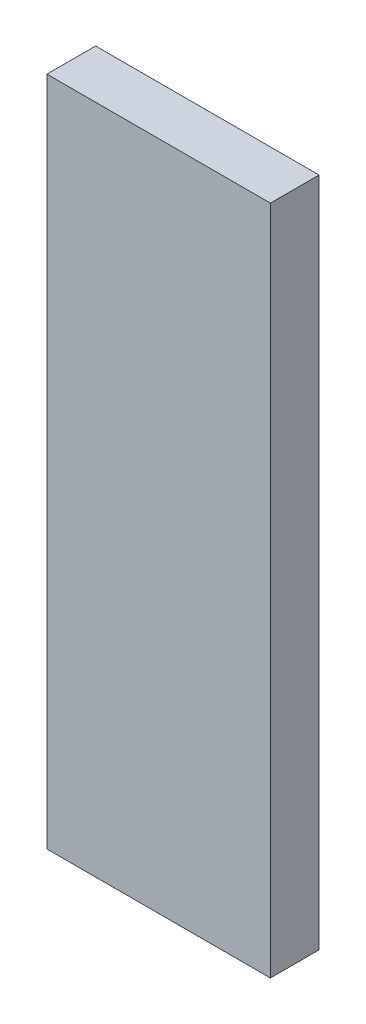
ISO-10303-21;
HEADER;
FILE_DESCRIPTION(('STEP AP214'),'2;1');
FILE_NAME('part.step','',(''),(''),'','','');
FILE_SCHEMA(('AUTOMOTIVE_DESIGN { 1 0 10303 214 1 1 1 1 }'));
ENDSEC;
DATA;
#1=APPLICATION_CONTEXT('core data for automotive mechanical design processes');
#2=APPLICATION_PROTOCOL_DEFINITION('international standard','automotive_design',2000,#1);
#3=PRODUCT_CONTEXT('',#1,'mechanical');
#4=PRODUCT('Part','Part','',(#3));
#5=PRODUCT_RELATED_PRODUCT_CATEGORY('part','',(#4));
#6=PRODUCT_DEFINITION_FORMATION('','',#4);
#7=PRODUCT_DEFINITION_CONTEXT('part definition',#1,'design');
#8=PRODUCT_DEFINITION('design','',#6,#7);
#9=PRODUCT_DEFINITION_SHAPE('','',#8);
#10=(LENGTH_UNIT() NAMED_UNIT(*) SI_UNIT(.MILLI.,.METRE.));
#11=(NAMED_UNIT(*) PLANE_ANGLE_UNIT() SI_UNIT($,.RADIAN.));
#12=(NAMED_UNIT(*) SI_UNIT($,.STERADIAN.) SOLID_ANGLE_UNIT());
#13=UNCERTAINTY_MEASURE_WITH_UNIT(LENGTH_MEASURE(1.E-05),#10,'distance_accuracy_value','');
#14=(GEOMETRIC_REPRESENTATION_CONTEXT(3) GLOBAL_UNCERTAINTY_ASSIGNED_CONTEXT((#13)) GLOBAL_UNIT_ASSIGNED_CONTEXT((#10,
#11,#12)) REPRESENTATION_CONTEXT('',''));
#15=CARTESIAN_POINT('',(0.,0.,0.));
#16=DIRECTION('',(0.,0.,1.));
#17=DIRECTION('',(1.,0.,0.));
#18=AXIS2_PLACEMENT_3D('',#15,#16,#17);
#19=CARTESIAN_POINT('',(-21.7182300884955,31.0897345132743,7.));
#20=DIRECTION('',(1.,0.,0.));
#21=DIRECTION('',(0.,1.,0.));
#22=AXIS2_PLACEMENT_3D('',#19,#20,#21);
#23=PLANE('',#22);
#24=DIRECTION('',(0.,-1.,0.));
#25=VECTOR('',#24,1.);
#26=CARTESIAN_POINT('',(-21.7182300884955,31.0897345132743,0.));
#27=LINE('',#26,#25);
#28=CARTESIAN_POINT('',(-21.7182300884955,31.0897345132743,0.));
#29=VERTEX_POINT('',#28);
#30=CARTESIAN_POINT('',(-21.7182300884955,-65.3702654867257,0.));
#31=VERTEX_POINT('',#30);
#32=EDGE_CURVE('E107',#29,#31,#27,.T.);
#33=ORIENTED_EDGE('',*,*,#32,.T.);
#34=DIRECTION('',(0.,0.,-1.));
#35=VECTOR('',#34,1.);
#36=CARTESIAN_POINT('',(-21.7182300884955,-65.3702654867257,7.));
#37=LINE('',#36,#35);
#38=CARTESIAN_POINT('',(-21.7182300884955,-65.3702654867257,7.));
#39=VERTEX_POINT('',#38);
#40=EDGE_CURVE('E11',#39,#31,#37,.T.);
#41=ORIENTED_EDGE('',*,*,#40,.F.);
#42=DIRECTION('',(0.,-1.,0.));
#43=VECTOR('',#42,1.);
#44=CARTESIAN_POINT('',(-21.7182300884955,31.0897345132743,7.));
#45=LINE('',#44,#43);
#46=CARTESIAN_POINT('',(-21.7182300884955,31.0897345132743,7.));
#47=VERTEX_POINT('',#46);
#48=EDGE_CURVE('E91',#47,#39,#45,.T.);
#49=ORIENTED_EDGE('',*,*,#48,.F.);
#50=DIRECTION('',(0.,0.,-1.));
#51=VECTOR('',#50,1.);
#52=CARTESIAN_POINT('',(-21.7182300884955,31.0897345132743,7.));
#53=LINE('',#52,#51);
#54=EDGE_CURVE('E103',#47,#29,#53,.T.);
#55=ORIENTED_EDGE('',*,*,#54,.T.);
#56=EDGE_LOOP('',(#33,#41,#49,#55));
#57=FACE_BOUND('',#56,.T.);
#58=ADVANCED_FACE('F39',(#57),#23,.F.);
#59=CARTESIAN_POINT('',(-21.7182300884955,-65.3702654867257,7.));
#60=DIRECTION('',(0.,1.,0.));
#61=DIRECTION('',(0.,0.,1.));
#62=AXIS2_PLACEMENT_3D('',#59,#60,#61);
#63=PLANE('',#62);
#64=DIRECTION('',(1.,0.,0.));
#65=VECTOR('',#64,1.);
#66=CARTESIAN_POINT('',(-21.7182300884955,-65.3702654867257,0.));
#67=LINE('',#66,#65);
#68=CARTESIAN_POINT('',(10.4017699115045,-65.3702654867257,0.));
#69=VERTEX_POINT('',#68);
#70=EDGE_CURVE('E96',#31,#69,#67,.T.);
#71=ORIENTED_EDGE('',*,*,#70,.T.);
#72=DIRECTION('',(0.,0.,-1.));
#73=VECTOR('',#72,1.);
#74=CARTESIAN_POINT('',(10.4017699115045,-65.3702654867257,7.));
#75=LINE('',#74,#73);
#76=CARTESIAN_POINT('',(10.4017699115045,-65.3702654867257,7.));
#77=VERTEX_POINT('',#76);
#78=EDGE_CURVE('E48',#77,#69,#75,.T.);
#79=ORIENTED_EDGE('',*,*,#78,.F.);
#80=DIRECTION('',(1.,0.,0.));
#81=VECTOR('',#80,1.);
#82=CARTESIAN_POINT('',(-21.7182300884955,-65.3702654867257,7.));
#83=LINE('',#82,#81);
#84=EDGE_CURVE('E86',#39,#77,#83,.T.);
#85=ORIENTED_EDGE('',*,*,#84,.F.);
#86=ORIENTED_EDGE('',*,*,#40,.T.);
#87=EDGE_LOOP('',(#71,#79,#85,#86));
#88=FACE_BOUND('',#87,.T.);
#89=ADVANCED_FACE('F95',(#88),#63,.F.);
#90=CARTESIAN_POINT('',(10.4017699115044,31.0897345132743,7.));
#91=DIRECTION('',(-1.,0.,0.));
#92=DIRECTION('',(0.,-1.,0.));
#93=AXIS2_PLACEMENT_3D('',#90,#91,#92);
#94=PLANE('',#93);
#95=DIRECTION('',(0.,1.,0.));
#96=VECTOR('',#95,1.);
#97=CARTESIAN_POINT('',(10.4017699115044,31.0897345132743,0.));
#98=LINE('',#97,#96);
#99=CARTESIAN_POINT('',(10.4017699115044,31.0897345132743,0.));
#100=VERTEX_POINT('',#99);
#101=EDGE_CURVE('E73',#69,#100,#98,.T.);
#102=ORIENTED_EDGE('',*,*,#101,.T.);
#103=DIRECTION('',(0.,0.,-1.));
#104=VECTOR('',#103,1.);
#105=CARTESIAN_POINT('',(10.4017699115044,31.0897345132743,7.));
#106=LINE('',#105,#104);
#107=CARTESIAN_POINT('',(10.4017699115044,31.0897345132743,7.));
#108=VERTEX_POINT('',#107);
#109=EDGE_CURVE('E98',#108,#100,#106,.T.);
#110=ORIENTED_EDGE('',*,*,#109,.F.);
#111=DIRECTION('',(0.,1.,0.));
#112=VECTOR('',#111,1.);
#113=CARTESIAN_POINT('',(10.4017699115044,31.0897345132743,7.));
#114=LINE('',#113,#112);
#115=EDGE_CURVE('E89',#77,#108,#114,.T.);
#116=ORIENTED_EDGE('',*,*,#115,.F.);
#117=ORIENTED_EDGE('',*,*,#78,.T.);
#118=EDGE_LOOP('',(#102,#110,#116,#117));
#119=FACE_BOUND('',#118,.T.);
#120=ADVANCED_FACE('F99',(#119),#94,.F.);
#121=CARTESIAN_POINT('',(-21.7182300884955,31.0897345132743,7.));
#122=DIRECTION('',(0.,-1.,0.));
#123=DIRECTION('',(0.,0.,-1.));
#124=AXIS2_PLACEMENT_3D('',#121,#122,#123);
#125=PLANE('',#124);
#126=DIRECTION('',(-1.,0.,0.));
#127=VECTOR('',#126,1.);
#128=CARTESIAN_POINT('',(-21.7182300884955,31.0897345132743,0.));
#129=LINE('',#128,#127);
#130=EDGE_CURVE('E79',#100,#29,#129,.T.);
#131=ORIENTED_EDGE('',*,*,#130,.T.);
#132=ORIENTED_EDGE('',*,*,#54,.F.);
#133=DIRECTION('',(-1.,0.,0.));
#134=VECTOR('',#133,1.);
#135=CARTESIAN_POINT('',(-21.7182300884955,31.0897345132743,7.));
#136=LINE('',#135,#134);
#137=EDGE_CURVE('E56',#108,#47,#136,.T.);
#138=ORIENTED_EDGE('',*,*,#137,.F.);
#139=ORIENTED_EDGE('',*,*,#109,.T.);
#140=EDGE_LOOP('',(#131,#132,#138,#139));
#141=FACE_BOUND('',#140,.T.);
#142=ADVANCED_FACE('F120',(#141),#125,.F.);
#143=CARTESIAN_POINT('',(0.,0.,7.));
#144=DIRECTION('',(0.,0.,1.));
#145=DIRECTION('',(1.,0.,0.));
#146=AXIS2_PLACEMENT_3D('',#143,#144,#145);
#147=PLANE('',#146);
#148=ORIENTED_EDGE('',*,*,#48,.T.);
#149=ORIENTED_EDGE('',*,*,#84,.T.);
#150=ORIENTED_EDGE('',*,*,#115,.T.);
#151=ORIENTED_EDGE('',*,*,#137,.T.);
#152=EDGE_LOOP('',(#148,#149,#150,#151));
#153=FACE_BOUND('',#152,.T.);
#154=ADVANCED_FACE('F87',(#153),#147,.T.);
#155=CARTESIAN_POINT('',(0.,0.,0.));
#156=DIRECTION('',(0.,0.,1.));
#157=DIRECTION('',(1.,0.,0.));
#158=AXIS2_PLACEMENT_3D('',#155,#156,#157);
#159=PLANE('',#158);
#160=ORIENTED_EDGE('',*,*,#32,.F.);
#161=ORIENTED_EDGE('',*,*,#130,.F.);
#162=ORIENTED_EDGE('',*,*,#101,.F.);
#163=ORIENTED_EDGE('',*,*,#70,.F.);
#164=EDGE_LOOP('',(#160,#161,#162,#163));
#165=FACE_BOUND('',#164,.T.);
#166=ADVANCED_FACE('F123',(#165),#159,.F.);
#167=CLOSED_SHELL('',(#58,#89,#120,#142,#154,#166));
#168=MANIFOLD_SOLID_BREP('B2',#167);
#169=ADVANCED_BREP_SHAPE_REPRESENTATION('',(#18,#168),#14);
#170=SHAPE_DEFINITION_REPRESENTATION(#9,#169);
ENDSEC;
END-ISO-10303-21;
